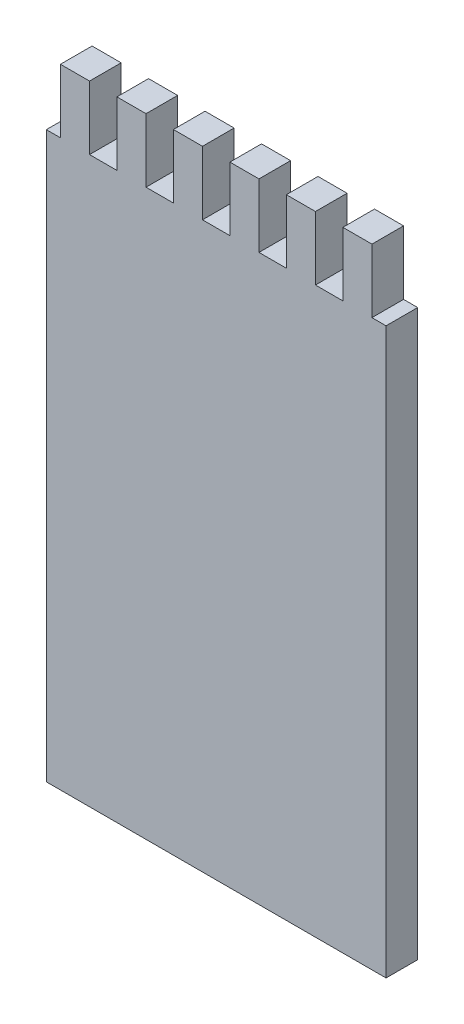
ISO-10303-21;
HEADER;
FILE_DESCRIPTION(('STEP AP214'),'2;1');
FILE_NAME('part.step','',(''),(''),'','','');
FILE_SCHEMA(('AUTOMOTIVE_DESIGN { 1 0 10303 214 1 1 1 1 }'));
ENDSEC;
DATA;
#1=APPLICATION_CONTEXT('core data for automotive mechanical design processes');
#2=APPLICATION_PROTOCOL_DEFINITION('international standard','automotive_design',2000,#1);
#3=PRODUCT_CONTEXT('',#1,'mechanical');
#4=PRODUCT('Part','Part','',(#3));
#5=PRODUCT_RELATED_PRODUCT_CATEGORY('part','',(#4));
#6=PRODUCT_DEFINITION_FORMATION('','',#4);
#7=PRODUCT_DEFINITION_CONTEXT('part definition',#1,'design');
#8=PRODUCT_DEFINITION('design','',#6,#7);
#9=PRODUCT_DEFINITION_SHAPE('','',#8);
#10=(LENGTH_UNIT() NAMED_UNIT(*) SI_UNIT(.MILLI.,.METRE.));
#11=(NAMED_UNIT(*) PLANE_ANGLE_UNIT() SI_UNIT($,.RADIAN.));
#12=(NAMED_UNIT(*) SI_UNIT($,.STERADIAN.) SOLID_ANGLE_UNIT());
#13=UNCERTAINTY_MEASURE_WITH_UNIT(LENGTH_MEASURE(1.E-05),#10,'distance_accuracy_value','');
#14=(GEOMETRIC_REPRESENTATION_CONTEXT(3) GLOBAL_UNCERTAINTY_ASSIGNED_CONTEXT((#13)) GLOBAL_UNIT_ASSIGNED_CONTEXT((#10,
#11,#12)) REPRESENTATION_CONTEXT('',''));
#15=CARTESIAN_POINT('',(0.,0.,0.));
#16=DIRECTION('',(0.,0.,1.));
#17=DIRECTION('',(1.,0.,0.));
#18=AXIS2_PLACEMENT_3D('',#15,#16,#17);
#19=CARTESIAN_POINT('',(27.575,44.6,5.6));
#20=DIRECTION('',(0.,-1.,0.));
#21=DIRECTION('',(1.,0.,0.));
#22=AXIS2_PLACEMENT_3D('',#19,#20,#21);
#23=PLANE('',#22);
#24=DIRECTION('',(-1.,0.,0.));
#25=VECTOR('',#24,1.);
#26=CARTESIAN_POINT('',(27.575,44.6,0.));
#27=LINE('',#26,#25);
#28=CARTESIAN_POINT('',(30.075,44.6,0.));
#29=VERTEX_POINT('',#28);
#30=CARTESIAN_POINT('',(27.575,44.6,0.));
#31=VERTEX_POINT('',#30);
#32=EDGE_CURVE('E249',#29,#31,#27,.T.);
#33=ORIENTED_EDGE('',*,*,#32,.T.);
#34=DIRECTION('',(0.,0.,-1.));
#35=VECTOR('',#34,1.);
#36=CARTESIAN_POINT('',(27.575,44.6,5.6));
#37=LINE('',#36,#35);
#38=CARTESIAN_POINT('',(27.575,44.6,5.6));
#39=VERTEX_POINT('',#38);
#40=EDGE_CURVE('E11',#39,#31,#37,.T.);
#41=ORIENTED_EDGE('',*,*,#40,.F.);
#42=DIRECTION('',(-1.,0.,0.));
#43=VECTOR('',#42,1.);
#44=CARTESIAN_POINT('',(27.575,44.6,5.6));
#45=LINE('',#44,#43);
#46=CARTESIAN_POINT('',(30.075,44.6,5.6));
#47=VERTEX_POINT('',#46);
#48=EDGE_CURVE('E303',#47,#39,#45,.T.);
#49=ORIENTED_EDGE('',*,*,#48,.F.);
#50=DIRECTION('',(0.,0.,-1.));
#51=VECTOR('',#50,1.);
#52=CARTESIAN_POINT('',(30.075,44.6,5.6));
#53=LINE('',#52,#51);
#54=EDGE_CURVE('E245',#47,#29,#53,.T.);
#55=ORIENTED_EDGE('',*,*,#54,.T.);
#56=EDGE_LOOP('',(#33,#41,#49,#55));
#57=FACE_BOUND('',#56,.T.);
#58=ADVANCED_FACE('F33',(#57),#23,.F.);
#59=CARTESIAN_POINT('',(27.575,44.6,5.6));
#60=DIRECTION('',(-1.,0.,0.));
#61=DIRECTION('',(0.,-1.,0.));
#62=AXIS2_PLACEMENT_3D('',#59,#60,#61);
#63=PLANE('',#62);
#64=DIRECTION('',(0.,1.,0.));
#65=VECTOR('',#64,1.);
#66=CARTESIAN_POINT('',(27.575,44.6,0.));
#67=LINE('',#66,#65);
#68=CARTESIAN_POINT('',(27.575,55.875,0.));
#69=VERTEX_POINT('',#68);
#70=EDGE_CURVE('E252',#31,#69,#67,.T.);
#71=ORIENTED_EDGE('',*,*,#70,.T.);
#72=DIRECTION('',(0.,0.,-1.));
#73=VECTOR('',#72,1.);
#74=CARTESIAN_POINT('',(27.575,55.875,5.6));
#75=LINE('',#74,#73);
#76=CARTESIAN_POINT('',(27.575,55.875,5.6));
#77=VERTEX_POINT('',#76);
#78=EDGE_CURVE('E41',#77,#69,#75,.T.);
#79=ORIENTED_EDGE('',*,*,#78,.F.);
#80=DIRECTION('',(0.,1.,0.));
#81=VECTOR('',#80,1.);
#82=CARTESIAN_POINT('',(27.575,44.6,5.6));
#83=LINE('',#82,#81);
#84=EDGE_CURVE('E151',#39,#77,#83,.T.);
#85=ORIENTED_EDGE('',*,*,#84,.F.);
#86=ORIENTED_EDGE('',*,*,#40,.T.);
#87=EDGE_LOOP('',(#71,#79,#85,#86));
#88=FACE_BOUND('',#87,.T.);
#89=ADVANCED_FACE('F461',(#88),#63,.F.);
#90=CARTESIAN_POINT('',(22.425,55.875,5.6));
#91=DIRECTION('',(0.,-1.,0.));
#92=DIRECTION('',(0.,0.,-1.));
#93=AXIS2_PLACEMENT_3D('',#90,#91,#92);
#94=PLANE('',#93);
#95=DIRECTION('',(-1.,0.,0.));
#96=VECTOR('',#95,1.);
#97=CARTESIAN_POINT('',(22.425,55.875,0.));
#98=LINE('',#97,#96);
#99=CARTESIAN_POINT('',(22.425,55.875,0.));
#100=VERTEX_POINT('',#99);
#101=EDGE_CURVE('E254',#69,#100,#98,.T.);
#102=ORIENTED_EDGE('',*,*,#101,.T.);
#103=DIRECTION('',(0.,0.,-1.));
#104=VECTOR('',#103,1.);
#105=CARTESIAN_POINT('',(22.425,55.875,5.6));
#106=LINE('',#105,#104);
#107=CARTESIAN_POINT('',(22.425,55.875,5.6));
#108=VERTEX_POINT('',#107);
#109=EDGE_CURVE('E370',#108,#100,#106,.T.);
#110=ORIENTED_EDGE('',*,*,#109,.F.);
#111=DIRECTION('',(-1.,0.,0.));
#112=VECTOR('',#111,1.);
#113=CARTESIAN_POINT('',(22.425,55.875,5.6));
#114=LINE('',#113,#112);
#115=EDGE_CURVE('E378',#77,#108,#114,.T.);
#116=ORIENTED_EDGE('',*,*,#115,.F.);
#117=ORIENTED_EDGE('',*,*,#78,.T.);
#118=EDGE_LOOP('',(#102,#110,#116,#117));
#119=FACE_BOUND('',#118,.T.);
#120=ADVANCED_FACE('F376',(#119),#94,.F.);
#121=CARTESIAN_POINT('',(22.425,44.6,5.6));
#122=DIRECTION('',(1.,0.,0.));
#123=DIRECTION('',(0.,0.,-1.));
#124=AXIS2_PLACEMENT_3D('',#121,#122,#123);
#125=PLANE('',#124);
#126=DIRECTION('',(0.,-1.,0.));
#127=VECTOR('',#126,1.);
#128=CARTESIAN_POINT('',(22.425,44.6,0.));
#129=LINE('',#128,#127);
#130=CARTESIAN_POINT('',(22.425,44.6,0.));
#131=VERTEX_POINT('',#130);
#132=EDGE_CURVE('E256',#100,#131,#129,.T.);
#133=ORIENTED_EDGE('',*,*,#132,.T.);
#134=DIRECTION('',(0.,0.,-1.));
#135=VECTOR('',#134,1.);
#136=CARTESIAN_POINT('',(22.425,44.6,5.6));
#137=LINE('',#136,#135);
#138=CARTESIAN_POINT('',(22.425,44.6,5.6));
#139=VERTEX_POINT('',#138);
#140=EDGE_CURVE('E367',#139,#131,#137,.T.);
#141=ORIENTED_EDGE('',*,*,#140,.F.);
#142=DIRECTION('',(0.,-1.,0.));
#143=VECTOR('',#142,1.);
#144=CARTESIAN_POINT('',(22.425,44.6,5.6));
#145=LINE('',#144,#143);
#146=EDGE_CURVE('E396',#108,#139,#145,.T.);
#147=ORIENTED_EDGE('',*,*,#146,.F.);
#148=ORIENTED_EDGE('',*,*,#109,.T.);
#149=EDGE_LOOP('',(#133,#141,#147,#148));
#150=FACE_BOUND('',#149,.T.);
#151=ADVANCED_FACE('F387',(#150),#125,.F.);
#152=CARTESIAN_POINT('',(17.575,44.6,5.6));
#153=DIRECTION('',(0.,-1.,0.));
#154=DIRECTION('',(0.,0.,-1.));
#155=AXIS2_PLACEMENT_3D('',#152,#153,#154);
#156=PLANE('',#155);
#157=DIRECTION('',(-1.,0.,0.));
#158=VECTOR('',#157,1.);
#159=CARTESIAN_POINT('',(17.575,44.6,0.));
#160=LINE('',#159,#158);
#161=CARTESIAN_POINT('',(17.575,44.6,0.));
#162=VERTEX_POINT('',#161);
#163=EDGE_CURVE('E258',#131,#162,#160,.T.);
#164=ORIENTED_EDGE('',*,*,#163,.T.);
#165=DIRECTION('',(0.,0.,-1.));
#166=VECTOR('',#165,1.);
#167=CARTESIAN_POINT('',(17.575,44.6,5.6));
#168=LINE('',#167,#166);
#169=CARTESIAN_POINT('',(17.575,44.6,5.6));
#170=VERTEX_POINT('',#169);
#171=EDGE_CURVE('E364',#170,#162,#168,.T.);
#172=ORIENTED_EDGE('',*,*,#171,.F.);
#173=DIRECTION('',(-1.,0.,0.));
#174=VECTOR('',#173,1.);
#175=CARTESIAN_POINT('',(17.575,44.6,5.6));
#176=LINE('',#175,#174);
#177=EDGE_CURVE('E393',#139,#170,#176,.T.);
#178=ORIENTED_EDGE('',*,*,#177,.F.);
#179=ORIENTED_EDGE('',*,*,#140,.T.);
#180=EDGE_LOOP('',(#164,#172,#178,#179));
#181=FACE_BOUND('',#180,.T.);
#182=ADVANCED_FACE('F391',(#181),#156,.F.);
#183=CARTESIAN_POINT('',(17.575,44.6,5.6));
#184=DIRECTION('',(-1.,0.,0.));
#185=DIRECTION('',(0.,0.,1.));
#186=AXIS2_PLACEMENT_3D('',#183,#184,#185);
#187=PLANE('',#186);
#188=DIRECTION('',(0.,1.,0.));
#189=VECTOR('',#188,1.);
#190=CARTESIAN_POINT('',(17.575,44.6,0.));
#191=LINE('',#190,#189);
#192=CARTESIAN_POINT('',(17.575,55.875,0.));
#193=VERTEX_POINT('',#192);
#194=EDGE_CURVE('E260',#162,#193,#191,.T.);
#195=ORIENTED_EDGE('',*,*,#194,.T.);
#196=DIRECTION('',(0.,0.,-1.));
#197=VECTOR('',#196,1.);
#198=CARTESIAN_POINT('',(17.575,55.875,5.6));
#199=LINE('',#198,#197);
#200=CARTESIAN_POINT('',(17.575,55.875,5.6));
#201=VERTEX_POINT('',#200);
#202=EDGE_CURVE('E361',#201,#193,#199,.T.);
#203=ORIENTED_EDGE('',*,*,#202,.F.);
#204=DIRECTION('',(0.,1.,0.));
#205=VECTOR('',#204,1.);
#206=CARTESIAN_POINT('',(17.575,44.6,5.6));
#207=LINE('',#206,#205);
#208=EDGE_CURVE('E395',#170,#201,#207,.T.);
#209=ORIENTED_EDGE('',*,*,#208,.F.);
#210=ORIENTED_EDGE('',*,*,#171,.T.);
#211=EDGE_LOOP('',(#195,#203,#209,#210));
#212=FACE_BOUND('',#211,.T.);
#213=ADVANCED_FACE('F474',(#212),#187,.F.);
#214=CARTESIAN_POINT('',(12.425,55.875,5.6));
#215=DIRECTION('',(0.,-1.,0.));
#216=DIRECTION('',(0.,0.,-1.));
#217=AXIS2_PLACEMENT_3D('',#214,#215,#216);
#218=PLANE('',#217);
#219=DIRECTION('',(-1.,0.,0.));
#220=VECTOR('',#219,1.);
#221=CARTESIAN_POINT('',(12.425,55.875,0.));
#222=LINE('',#221,#220);
#223=CARTESIAN_POINT('',(12.425,55.875,0.));
#224=VERTEX_POINT('',#223);
#225=EDGE_CURVE('E262',#193,#224,#222,.T.);
#226=ORIENTED_EDGE('',*,*,#225,.T.);
#227=DIRECTION('',(0.,0.,-1.));
#228=VECTOR('',#227,1.);
#229=CARTESIAN_POINT('',(12.425,55.875,5.6));
#230=LINE('',#229,#228);
#231=CARTESIAN_POINT('',(12.425,55.875,5.6));
#232=VERTEX_POINT('',#231);
#233=EDGE_CURVE('E358',#232,#224,#230,.T.);
#234=ORIENTED_EDGE('',*,*,#233,.F.);
#235=DIRECTION('',(-1.,0.,0.));
#236=VECTOR('',#235,1.);
#237=CARTESIAN_POINT('',(12.425,55.875,5.6));
#238=LINE('',#237,#236);
#239=EDGE_CURVE('E398',#201,#232,#238,.T.);
#240=ORIENTED_EDGE('',*,*,#239,.F.);
#241=ORIENTED_EDGE('',*,*,#202,.T.);
#242=EDGE_LOOP('',(#226,#234,#240,#241));
#243=FACE_BOUND('',#242,.T.);
#244=ADVANCED_FACE('F477',(#243),#218,.F.);
#245=CARTESIAN_POINT('',(12.425,44.6,5.6));
#246=DIRECTION('',(1.,0.,0.));
#247=DIRECTION('',(0.,0.,-1.));
#248=AXIS2_PLACEMENT_3D('',#245,#246,#247);
#249=PLANE('',#248);
#250=DIRECTION('',(0.,-1.,0.));
#251=VECTOR('',#250,1.);
#252=CARTESIAN_POINT('',(12.425,44.6,0.));
#253=LINE('',#252,#251);
#254=CARTESIAN_POINT('',(12.425,44.6,0.));
#255=VERTEX_POINT('',#254);
#256=EDGE_CURVE('E264',#224,#255,#253,.T.);
#257=ORIENTED_EDGE('',*,*,#256,.T.);
#258=DIRECTION('',(0.,0.,-1.));
#259=VECTOR('',#258,1.);
#260=CARTESIAN_POINT('',(12.425,44.6,5.6));
#261=LINE('',#260,#259);
#262=CARTESIAN_POINT('',(12.425,44.6,5.6));
#263=VERTEX_POINT('',#262);
#264=EDGE_CURVE('E355',#263,#255,#261,.T.);
#265=ORIENTED_EDGE('',*,*,#264,.F.);
#266=DIRECTION('',(0.,-1.,0.));
#267=VECTOR('',#266,1.);
#268=CARTESIAN_POINT('',(12.425,44.6,5.6));
#269=LINE('',#268,#267);
#270=EDGE_CURVE('E404',#232,#263,#269,.T.);
#271=ORIENTED_EDGE('',*,*,#270,.F.);
#272=ORIENTED_EDGE('',*,*,#233,.T.);
#273=EDGE_LOOP('',(#257,#265,#271,#272));
#274=FACE_BOUND('',#273,.T.);
#275=ADVANCED_FACE('F481',(#274),#249,.F.);
#276=CARTESIAN_POINT('',(7.575,44.6,5.6));
#277=DIRECTION('',(0.,-1.,0.));
#278=DIRECTION('',(0.,0.,-1.));
#279=AXIS2_PLACEMENT_3D('',#276,#277,#278);
#280=PLANE('',#279);
#281=DIRECTION('',(-1.,0.,0.));
#282=VECTOR('',#281,1.);
#283=CARTESIAN_POINT('',(7.575,44.6,0.));
#284=LINE('',#283,#282);
#285=CARTESIAN_POINT('',(7.575,44.6,0.));
#286=VERTEX_POINT('',#285);
#287=EDGE_CURVE('E266',#255,#286,#284,.T.);
#288=ORIENTED_EDGE('',*,*,#287,.T.);
#289=DIRECTION('',(0.,0.,-1.));
#290=VECTOR('',#289,1.);
#291=CARTESIAN_POINT('',(7.575,44.6,5.6));
#292=LINE('',#291,#290);
#293=CARTESIAN_POINT('',(7.575,44.6,5.6));
#294=VERTEX_POINT('',#293);
#295=EDGE_CURVE('E352',#294,#286,#292,.T.);
#296=ORIENTED_EDGE('',*,*,#295,.F.);
#297=DIRECTION('',(-1.,0.,0.));
#298=VECTOR('',#297,1.);
#299=CARTESIAN_POINT('',(7.575,44.6,5.6));
#300=LINE('',#299,#298);
#301=EDGE_CURVE('E406',#263,#294,#300,.T.);
#302=ORIENTED_EDGE('',*,*,#301,.F.);
#303=ORIENTED_EDGE('',*,*,#264,.T.);
#304=EDGE_LOOP('',(#288,#296,#302,#303));
#305=FACE_BOUND('',#304,.T.);
#306=ADVANCED_FACE('F485',(#305),#280,.F.);
#307=CARTESIAN_POINT('',(7.575,44.6,5.6));
#308=DIRECTION('',(-1.,0.,0.));
#309=DIRECTION('',(0.,0.,1.));
#310=AXIS2_PLACEMENT_3D('',#307,#308,#309);
#311=PLANE('',#310);
#312=DIRECTION('',(0.,1.,0.));
#313=VECTOR('',#312,1.);
#314=CARTESIAN_POINT('',(7.575,44.6,0.));
#315=LINE('',#314,#313);
#316=CARTESIAN_POINT('',(7.575,55.875,0.));
#317=VERTEX_POINT('',#316);
#318=EDGE_CURVE('E268',#286,#317,#315,.T.);
#319=ORIENTED_EDGE('',*,*,#318,.T.);
#320=DIRECTION('',(0.,0.,-1.));
#321=VECTOR('',#320,1.);
#322=CARTESIAN_POINT('',(7.575,55.875,5.6));
#323=LINE('',#322,#321);
#324=CARTESIAN_POINT('',(7.575,55.875,5.6));
#325=VERTEX_POINT('',#324);
#326=EDGE_CURVE('E349',#325,#317,#323,.T.);
#327=ORIENTED_EDGE('',*,*,#326,.F.);
#328=DIRECTION('',(0.,1.,0.));
#329=VECTOR('',#328,1.);
#330=CARTESIAN_POINT('',(7.575,44.6,5.6));
#331=LINE('',#330,#329);
#332=EDGE_CURVE('E408',#294,#325,#331,.T.);
#333=ORIENTED_EDGE('',*,*,#332,.F.);
#334=ORIENTED_EDGE('',*,*,#295,.T.);
#335=EDGE_LOOP('',(#319,#327,#333,#334));
#336=FACE_BOUND('',#335,.T.);
#337=ADVANCED_FACE('F489',(#336),#311,.F.);
#338=CARTESIAN_POINT('',(2.425,55.875,5.6));
#339=DIRECTION('',(0.,-1.,0.));
#340=DIRECTION('',(0.,0.,-1.));
#341=AXIS2_PLACEMENT_3D('',#338,#339,#340);
#342=PLANE('',#341);
#343=DIRECTION('',(-1.,0.,0.));
#344=VECTOR('',#343,1.);
#345=CARTESIAN_POINT('',(2.425,55.875,0.));
#346=LINE('',#345,#344);
#347=CARTESIAN_POINT('',(2.425,55.875,0.));
#348=VERTEX_POINT('',#347);
#349=EDGE_CURVE('E270',#317,#348,#346,.T.);
#350=ORIENTED_EDGE('',*,*,#349,.T.);
#351=DIRECTION('',(0.,0.,-1.));
#352=VECTOR('',#351,1.);
#353=CARTESIAN_POINT('',(2.425,55.875,5.6));
#354=LINE('',#353,#352);
#355=CARTESIAN_POINT('',(2.425,55.875,5.6));
#356=VERTEX_POINT('',#355);
#357=EDGE_CURVE('E346',#356,#348,#354,.T.);
#358=ORIENTED_EDGE('',*,*,#357,.F.);
#359=DIRECTION('',(-1.,0.,0.));
#360=VECTOR('',#359,1.);
#361=CARTESIAN_POINT('',(2.425,55.875,5.6));
#362=LINE('',#361,#360);
#363=EDGE_CURVE('E410',#325,#356,#362,.T.);
#364=ORIENTED_EDGE('',*,*,#363,.F.);
#365=ORIENTED_EDGE('',*,*,#326,.T.);
#366=EDGE_LOOP('',(#350,#358,#364,#365));
#367=FACE_BOUND('',#366,.T.);
#368=ADVANCED_FACE('F493',(#367),#342,.F.);
#369=CARTESIAN_POINT('',(2.425,44.6,5.6));
#370=DIRECTION('',(1.,0.,0.));
#371=DIRECTION('',(0.,0.,-1.));
#372=AXIS2_PLACEMENT_3D('',#369,#370,#371);
#373=PLANE('',#372);
#374=DIRECTION('',(0.,-1.,0.));
#375=VECTOR('',#374,1.);
#376=CARTESIAN_POINT('',(2.425,44.6,0.));
#377=LINE('',#376,#375);
#378=CARTESIAN_POINT('',(2.425,44.6,0.));
#379=VERTEX_POINT('',#378);
#380=EDGE_CURVE('E272',#348,#379,#377,.T.);
#381=ORIENTED_EDGE('',*,*,#380,.T.);
#382=DIRECTION('',(0.,0.,-1.));
#383=VECTOR('',#382,1.);
#384=CARTESIAN_POINT('',(2.425,44.6,5.6));
#385=LINE('',#384,#383);
#386=CARTESIAN_POINT('',(2.425,44.6,5.6));
#387=VERTEX_POINT('',#386);
#388=EDGE_CURVE('E343',#387,#379,#385,.T.);
#389=ORIENTED_EDGE('',*,*,#388,.F.);
#390=DIRECTION('',(0.,-1.,0.));
#391=VECTOR('',#390,1.);
#392=CARTESIAN_POINT('',(2.425,44.6,5.6));
#393=LINE('',#392,#391);
#394=EDGE_CURVE('E412',#356,#387,#393,.T.);
#395=ORIENTED_EDGE('',*,*,#394,.F.);
#396=ORIENTED_EDGE('',*,*,#357,.T.);
#397=EDGE_LOOP('',(#381,#389,#395,#396));
#398=FACE_BOUND('',#397,.T.);
#399=ADVANCED_FACE('F497',(#398),#373,.F.);
#400=CARTESIAN_POINT('',(-2.425,44.6,5.6));
#401=DIRECTION('',(0.,-1.,0.));
#402=DIRECTION('',(0.,0.,-1.));
#403=AXIS2_PLACEMENT_3D('',#400,#401,#402);
#404=PLANE('',#403);
#405=DIRECTION('',(-1.,0.,0.));
#406=VECTOR('',#405,1.);
#407=CARTESIAN_POINT('',(-2.425,44.6,0.));
#408=LINE('',#407,#406);
#409=CARTESIAN_POINT('',(-2.425,44.6,0.));
#410=VERTEX_POINT('',#409);
#411=EDGE_CURVE('E274',#379,#410,#408,.T.);
#412=ORIENTED_EDGE('',*,*,#411,.T.);
#413=DIRECTION('',(0.,0.,-1.));
#414=VECTOR('',#413,1.);
#415=CARTESIAN_POINT('',(-2.425,44.6,5.6));
#416=LINE('',#415,#414);
#417=CARTESIAN_POINT('',(-2.425,44.6,5.6));
#418=VERTEX_POINT('',#417);
#419=EDGE_CURVE('E340',#418,#410,#416,.T.);
#420=ORIENTED_EDGE('',*,*,#419,.F.);
#421=DIRECTION('',(-1.,0.,0.));
#422=VECTOR('',#421,1.);
#423=CARTESIAN_POINT('',(-2.425,44.6,5.6));
#424=LINE('',#423,#422);
#425=EDGE_CURVE('E414',#387,#418,#424,.T.);
#426=ORIENTED_EDGE('',*,*,#425,.F.);
#427=ORIENTED_EDGE('',*,*,#388,.T.);
#428=EDGE_LOOP('',(#412,#420,#426,#427));
#429=FACE_BOUND('',#428,.T.);
#430=ADVANCED_FACE('F501',(#429),#404,.F.);
#431=CARTESIAN_POINT('',(-2.425,44.6,5.6));
#432=DIRECTION('',(-1.,0.,0.));
#433=DIRECTION('',(0.,0.,1.));
#434=AXIS2_PLACEMENT_3D('',#431,#432,#433);
#435=PLANE('',#434);
#436=DIRECTION('',(0.,1.,0.));
#437=VECTOR('',#436,1.);
#438=CARTESIAN_POINT('',(-2.425,44.6,0.));
#439=LINE('',#438,#437);
#440=CARTESIAN_POINT('',(-2.425,55.875,0.));
#441=VERTEX_POINT('',#440);
#442=EDGE_CURVE('E276',#410,#441,#439,.T.);
#443=ORIENTED_EDGE('',*,*,#442,.T.);
#444=DIRECTION('',(0.,0.,-1.));
#445=VECTOR('',#444,1.);
#446=CARTESIAN_POINT('',(-2.425,55.875,5.6));
#447=LINE('',#446,#445);
#448=CARTESIAN_POINT('',(-2.425,55.875,5.6));
#449=VERTEX_POINT('',#448);
#450=EDGE_CURVE('E337',#449,#441,#447,.T.);
#451=ORIENTED_EDGE('',*,*,#450,.F.);
#452=DIRECTION('',(0.,1.,0.));
#453=VECTOR('',#452,1.);
#454=CARTESIAN_POINT('',(-2.425,44.6,5.6));
#455=LINE('',#454,#453);
#456=EDGE_CURVE('E416',#418,#449,#455,.T.);
#457=ORIENTED_EDGE('',*,*,#456,.F.);
#458=ORIENTED_EDGE('',*,*,#419,.T.);
#459=EDGE_LOOP('',(#443,#451,#457,#458));
#460=FACE_BOUND('',#459,.T.);
#461=ADVANCED_FACE('F505',(#460),#435,.F.);
#462=CARTESIAN_POINT('',(-7.575,55.875,5.6));
#463=DIRECTION('',(0.,-1.,0.));
#464=DIRECTION('',(0.,0.,-1.));
#465=AXIS2_PLACEMENT_3D('',#462,#463,#464);
#466=PLANE('',#465);
#467=DIRECTION('',(-1.,0.,0.));
#468=VECTOR('',#467,1.);
#469=CARTESIAN_POINT('',(-7.575,55.875,0.));
#470=LINE('',#469,#468);
#471=CARTESIAN_POINT('',(-7.575,55.875,0.));
#472=VERTEX_POINT('',#471);
#473=EDGE_CURVE('E278',#441,#472,#470,.T.);
#474=ORIENTED_EDGE('',*,*,#473,.T.);
#475=DIRECTION('',(0.,0.,-1.));
#476=VECTOR('',#475,1.);
#477=CARTESIAN_POINT('',(-7.575,55.875,5.6));
#478=LINE('',#477,#476);
#479=CARTESIAN_POINT('',(-7.575,55.875,5.6));
#480=VERTEX_POINT('',#479);
#481=EDGE_CURVE('E334',#480,#472,#478,.T.);
#482=ORIENTED_EDGE('',*,*,#481,.F.);
#483=DIRECTION('',(-1.,0.,0.));
#484=VECTOR('',#483,1.);
#485=CARTESIAN_POINT('',(-7.575,55.875,5.6));
#486=LINE('',#485,#484);
#487=EDGE_CURVE('E418',#449,#480,#486,.T.);
#488=ORIENTED_EDGE('',*,*,#487,.F.);
#489=ORIENTED_EDGE('',*,*,#450,.T.);
#490=EDGE_LOOP('',(#474,#482,#488,#489));
#491=FACE_BOUND('',#490,.T.);
#492=ADVANCED_FACE('F509',(#491),#466,.F.);
#493=CARTESIAN_POINT('',(-7.575,44.6,5.6));
#494=DIRECTION('',(1.,0.,0.));
#495=DIRECTION('',(0.,1.,0.));
#496=AXIS2_PLACEMENT_3D('',#493,#494,#495);
#497=PLANE('',#496);
#498=DIRECTION('',(0.,-1.,0.));
#499=VECTOR('',#498,1.);
#500=CARTESIAN_POINT('',(-7.575,44.6,0.));
#501=LINE('',#500,#499);
#502=CARTESIAN_POINT('',(-7.575,44.6,0.));
#503=VERTEX_POINT('',#502);
#504=EDGE_CURVE('E280',#472,#503,#501,.T.);
#505=ORIENTED_EDGE('',*,*,#504,.T.);
#506=DIRECTION('',(0.,0.,-1.));
#507=VECTOR('',#506,1.);
#508=CARTESIAN_POINT('',(-7.575,44.6,5.6));
#509=LINE('',#508,#507);
#510=CARTESIAN_POINT('',(-7.575,44.6,5.6));
#511=VERTEX_POINT('',#510);
#512=EDGE_CURVE('E331',#511,#503,#509,.T.);
#513=ORIENTED_EDGE('',*,*,#512,.F.);
#514=DIRECTION('',(0.,-1.,0.));
#515=VECTOR('',#514,1.);
#516=CARTESIAN_POINT('',(-7.575,44.6,5.6));
#517=LINE('',#516,#515);
#518=EDGE_CURVE('E420',#480,#511,#517,.T.);
#519=ORIENTED_EDGE('',*,*,#518,.F.);
#520=ORIENTED_EDGE('',*,*,#481,.T.);
#521=EDGE_LOOP('',(#505,#513,#519,#520));
#522=FACE_BOUND('',#521,.T.);
#523=ADVANCED_FACE('F513',(#522),#497,.F.);
#524=CARTESIAN_POINT('',(-12.425,44.6,5.6));
#525=DIRECTION('',(0.,-1.,0.));
#526=DIRECTION('',(0.,0.,-1.));
#527=AXIS2_PLACEMENT_3D('',#524,#525,#526);
#528=PLANE('',#527);
#529=DIRECTION('',(-1.,0.,0.));
#530=VECTOR('',#529,1.);
#531=CARTESIAN_POINT('',(-12.425,44.6,0.));
#532=LINE('',#531,#530);
#533=CARTESIAN_POINT('',(-12.425,44.6,0.));
#534=VERTEX_POINT('',#533);
#535=EDGE_CURVE('E282',#503,#534,#532,.T.);
#536=ORIENTED_EDGE('',*,*,#535,.T.);
#537=DIRECTION('',(0.,0.,-1.));
#538=VECTOR('',#537,1.);
#539=CARTESIAN_POINT('',(-12.425,44.6,5.6));
#540=LINE('',#539,#538);
#541=CARTESIAN_POINT('',(-12.425,44.6,5.6));
#542=VERTEX_POINT('',#541);
#543=EDGE_CURVE('E328',#542,#534,#540,.T.);
#544=ORIENTED_EDGE('',*,*,#543,.F.);
#545=DIRECTION('',(-1.,0.,0.));
#546=VECTOR('',#545,1.);
#547=CARTESIAN_POINT('',(-12.425,44.6,5.6));
#548=LINE('',#547,#546);
#549=EDGE_CURVE('E422',#511,#542,#548,.T.);
#550=ORIENTED_EDGE('',*,*,#549,.F.);
#551=ORIENTED_EDGE('',*,*,#512,.T.);
#552=EDGE_LOOP('',(#536,#544,#550,#551));
#553=FACE_BOUND('',#552,.T.);
#554=ADVANCED_FACE('F517',(#553),#528,.F.);
#555=CARTESIAN_POINT('',(-12.425,44.6,5.6));
#556=DIRECTION('',(-1.,0.,0.));
#557=DIRECTION('',(0.,0.,1.));
#558=AXIS2_PLACEMENT_3D('',#555,#556,#557);
#559=PLANE('',#558);
#560=DIRECTION('',(0.,1.,0.));
#561=VECTOR('',#560,1.);
#562=CARTESIAN_POINT('',(-12.425,44.6,0.));
#563=LINE('',#562,#561);
#564=CARTESIAN_POINT('',(-12.425,55.875,0.));
#565=VERTEX_POINT('',#564);
#566=EDGE_CURVE('E284',#534,#565,#563,.T.);
#567=ORIENTED_EDGE('',*,*,#566,.T.);
#568=DIRECTION('',(0.,0.,-1.));
#569=VECTOR('',#568,1.);
#570=CARTESIAN_POINT('',(-12.425,55.875,5.6));
#571=LINE('',#570,#569);
#572=CARTESIAN_POINT('',(-12.425,55.875,5.6));
#573=VERTEX_POINT('',#572);
#574=EDGE_CURVE('E325',#573,#565,#571,.T.);
#575=ORIENTED_EDGE('',*,*,#574,.F.);
#576=DIRECTION('',(0.,1.,0.));
#577=VECTOR('',#576,1.);
#578=CARTESIAN_POINT('',(-12.425,44.6,5.6));
#579=LINE('',#578,#577);
#580=EDGE_CURVE('E424',#542,#573,#579,.T.);
#581=ORIENTED_EDGE('',*,*,#580,.F.);
#582=ORIENTED_EDGE('',*,*,#543,.T.);
#583=EDGE_LOOP('',(#567,#575,#581,#582));
#584=FACE_BOUND('',#583,.T.);
#585=ADVANCED_FACE('F521',(#584),#559,.F.);
#586=CARTESIAN_POINT('',(-17.575,55.875,5.6));
#587=DIRECTION('',(0.,-1.,0.));
#588=DIRECTION('',(0.,0.,-1.));
#589=AXIS2_PLACEMENT_3D('',#586,#587,#588);
#590=PLANE('',#589);
#591=DIRECTION('',(-1.,0.,0.));
#592=VECTOR('',#591,1.);
#593=CARTESIAN_POINT('',(-17.575,55.875,0.));
#594=LINE('',#593,#592);
#595=CARTESIAN_POINT('',(-17.575,55.875,0.));
#596=VERTEX_POINT('',#595);
#597=EDGE_CURVE('E286',#565,#596,#594,.T.);
#598=ORIENTED_EDGE('',*,*,#597,.T.);
#599=DIRECTION('',(0.,0.,-1.));
#600=VECTOR('',#599,1.);
#601=CARTESIAN_POINT('',(-17.575,55.875,5.6));
#602=LINE('',#601,#600);
#603=CARTESIAN_POINT('',(-17.575,55.875,5.6));
#604=VERTEX_POINT('',#603);
#605=EDGE_CURVE('E322',#604,#596,#602,.T.);
#606=ORIENTED_EDGE('',*,*,#605,.F.);
#607=DIRECTION('',(-1.,0.,0.));
#608=VECTOR('',#607,1.);
#609=CARTESIAN_POINT('',(-17.575,55.875,5.6));
#610=LINE('',#609,#608);
#611=EDGE_CURVE('E426',#573,#604,#610,.T.);
#612=ORIENTED_EDGE('',*,*,#611,.F.);
#613=ORIENTED_EDGE('',*,*,#574,.T.);
#614=EDGE_LOOP('',(#598,#606,#612,#613));
#615=FACE_BOUND('',#614,.T.);
#616=ADVANCED_FACE('F525',(#615),#590,.F.);
#617=CARTESIAN_POINT('',(-17.575,44.6,5.6));
#618=DIRECTION('',(1.,0.,0.));
#619=DIRECTION('',(0.,0.,-1.));
#620=AXIS2_PLACEMENT_3D('',#617,#618,#619);
#621=PLANE('',#620);
#622=DIRECTION('',(0.,-1.,0.));
#623=VECTOR('',#622,1.);
#624=CARTESIAN_POINT('',(-17.575,44.6,0.));
#625=LINE('',#624,#623);
#626=CARTESIAN_POINT('',(-17.575,44.6,0.));
#627=VERTEX_POINT('',#626);
#628=EDGE_CURVE('E288',#596,#627,#625,.T.);
#629=ORIENTED_EDGE('',*,*,#628,.T.);
#630=DIRECTION('',(0.,0.,-1.));
#631=VECTOR('',#630,1.);
#632=CARTESIAN_POINT('',(-17.575,44.6,5.6));
#633=LINE('',#632,#631);
#634=CARTESIAN_POINT('',(-17.575,44.6,5.6));
#635=VERTEX_POINT('',#634);
#636=EDGE_CURVE('E319',#635,#627,#633,.T.);
#637=ORIENTED_EDGE('',*,*,#636,.F.);
#638=DIRECTION('',(0.,-1.,0.));
#639=VECTOR('',#638,1.);
#640=CARTESIAN_POINT('',(-17.575,44.6,5.6));
#641=LINE('',#640,#639);
#642=EDGE_CURVE('E428',#604,#635,#641,.T.);
#643=ORIENTED_EDGE('',*,*,#642,.F.);
#644=ORIENTED_EDGE('',*,*,#605,.T.);
#645=EDGE_LOOP('',(#629,#637,#643,#644));
#646=FACE_BOUND('',#645,.T.);
#647=ADVANCED_FACE('F529',(#646),#621,.F.);
#648=CARTESIAN_POINT('',(-22.425,44.6,5.6));
#649=DIRECTION('',(0.,-1.,0.));
#650=DIRECTION('',(0.,0.,-1.));
#651=AXIS2_PLACEMENT_3D('',#648,#649,#650);
#652=PLANE('',#651);
#653=DIRECTION('',(-1.,0.,0.));
#654=VECTOR('',#653,1.);
#655=CARTESIAN_POINT('',(-22.425,44.6,0.));
#656=LINE('',#655,#654);
#657=CARTESIAN_POINT('',(-22.425,44.6,0.));
#658=VERTEX_POINT('',#657);
#659=EDGE_CURVE('E290',#627,#658,#656,.T.);
#660=ORIENTED_EDGE('',*,*,#659,.T.);
#661=DIRECTION('',(0.,0.,-1.));
#662=VECTOR('',#661,1.);
#663=CARTESIAN_POINT('',(-22.425,44.6,5.6));
#664=LINE('',#663,#662);
#665=CARTESIAN_POINT('',(-22.425,44.6,5.6));
#666=VERTEX_POINT('',#665);
#667=EDGE_CURVE('E316',#666,#658,#664,.T.);
#668=ORIENTED_EDGE('',*,*,#667,.F.);
#669=DIRECTION('',(-1.,0.,0.));
#670=VECTOR('',#669,1.);
#671=CARTESIAN_POINT('',(-22.425,44.6,5.6));
#672=LINE('',#671,#670);
#673=EDGE_CURVE('E430',#635,#666,#672,.T.);
#674=ORIENTED_EDGE('',*,*,#673,.F.);
#675=ORIENTED_EDGE('',*,*,#636,.T.);
#676=EDGE_LOOP('',(#660,#668,#674,#675));
#677=FACE_BOUND('',#676,.T.);
#678=ADVANCED_FACE('F533',(#677),#652,.F.);
#679=CARTESIAN_POINT('',(-22.425,44.6,5.6));
#680=DIRECTION('',(-1.,0.,0.));
#681=DIRECTION('',(0.,0.,1.));
#682=AXIS2_PLACEMENT_3D('',#679,#680,#681);
#683=PLANE('',#682);
#684=DIRECTION('',(0.,1.,0.));
#685=VECTOR('',#684,1.);
#686=CARTESIAN_POINT('',(-22.425,44.6,0.));
#687=LINE('',#686,#685);
#688=CARTESIAN_POINT('',(-22.425,55.875,0.));
#689=VERTEX_POINT('',#688);
#690=EDGE_CURVE('E292',#658,#689,#687,.T.);
#691=ORIENTED_EDGE('',*,*,#690,.T.);
#692=DIRECTION('',(0.,0.,-1.));
#693=VECTOR('',#692,1.);
#694=CARTESIAN_POINT('',(-22.425,55.875,5.6));
#695=LINE('',#694,#693);
#696=CARTESIAN_POINT('',(-22.425,55.875,5.6));
#697=VERTEX_POINT('',#696);
#698=EDGE_CURVE('E313',#697,#689,#695,.T.);
#699=ORIENTED_EDGE('',*,*,#698,.F.);
#700=DIRECTION('',(0.,1.,0.));
#701=VECTOR('',#700,1.);
#702=CARTESIAN_POINT('',(-22.425,44.6,5.6));
#703=LINE('',#702,#701);
#704=EDGE_CURVE('E432',#666,#697,#703,.T.);
#705=ORIENTED_EDGE('',*,*,#704,.F.);
#706=ORIENTED_EDGE('',*,*,#667,.T.);
#707=EDGE_LOOP('',(#691,#699,#705,#706));
#708=FACE_BOUND('',#707,.T.);
#709=ADVANCED_FACE('F537',(#708),#683,.F.);
#710=CARTESIAN_POINT('',(-27.575,55.875,5.6));
#711=DIRECTION('',(0.,-1.,0.));
#712=DIRECTION('',(0.,0.,-1.));
#713=AXIS2_PLACEMENT_3D('',#710,#711,#712);
#714=PLANE('',#713);
#715=DIRECTION('',(-1.,0.,0.));
#716=VECTOR('',#715,1.);
#717=CARTESIAN_POINT('',(-27.575,55.875,0.));
#718=LINE('',#717,#716);
#719=CARTESIAN_POINT('',(-27.575,55.875,0.));
#720=VERTEX_POINT('',#719);
#721=EDGE_CURVE('E294',#689,#720,#718,.T.);
#722=ORIENTED_EDGE('',*,*,#721,.T.);
#723=DIRECTION('',(0.,0.,-1.));
#724=VECTOR('',#723,1.);
#725=CARTESIAN_POINT('',(-27.575,55.875,5.6));
#726=LINE('',#725,#724);
#727=CARTESIAN_POINT('',(-27.575,55.875,5.6));
#728=VERTEX_POINT('',#727);
#729=EDGE_CURVE('E310',#728,#720,#726,.T.);
#730=ORIENTED_EDGE('',*,*,#729,.F.);
#731=DIRECTION('',(-1.,0.,0.));
#732=VECTOR('',#731,1.);
#733=CARTESIAN_POINT('',(-27.575,55.875,5.6));
#734=LINE('',#733,#732);
#735=EDGE_CURVE('E434',#697,#728,#734,.T.);
#736=ORIENTED_EDGE('',*,*,#735,.F.);
#737=ORIENTED_EDGE('',*,*,#698,.T.);
#738=EDGE_LOOP('',(#722,#730,#736,#737));
#739=FACE_BOUND('',#738,.T.);
#740=ADVANCED_FACE('F541',(#739),#714,.F.);
#741=CARTESIAN_POINT('',(-27.575,44.6,5.6));
#742=DIRECTION('',(1.,0.,0.));
#743=DIRECTION('',(0.,0.,-1.));
#744=AXIS2_PLACEMENT_3D('',#741,#742,#743);
#745=PLANE('',#744);
#746=DIRECTION('',(0.,-1.,0.));
#747=VECTOR('',#746,1.);
#748=CARTESIAN_POINT('',(-27.575,44.6,0.));
#749=LINE('',#748,#747);
#750=CARTESIAN_POINT('',(-27.575,44.6,0.));
#751=VERTEX_POINT('',#750);
#752=EDGE_CURVE('E296',#720,#751,#749,.T.);
#753=ORIENTED_EDGE('',*,*,#752,.T.);
#754=DIRECTION('',(0.,0.,-1.));
#755=VECTOR('',#754,1.);
#756=CARTESIAN_POINT('',(-27.575,44.6,5.6));
#757=LINE('',#756,#755);
#758=CARTESIAN_POINT('',(-27.575,44.6,5.6));
#759=VERTEX_POINT('',#758);
#760=EDGE_CURVE('E307',#759,#751,#757,.T.);
#761=ORIENTED_EDGE('',*,*,#760,.F.);
#762=DIRECTION('',(0.,-1.,0.));
#763=VECTOR('',#762,1.);
#764=CARTESIAN_POINT('',(-27.575,44.6,5.6));
#765=LINE('',#764,#763);
#766=EDGE_CURVE('E436',#728,#759,#765,.T.);
#767=ORIENTED_EDGE('',*,*,#766,.F.);
#768=ORIENTED_EDGE('',*,*,#729,.T.);
#769=EDGE_LOOP('',(#753,#761,#767,#768));
#770=FACE_BOUND('',#769,.T.);
#771=ADVANCED_FACE('F442',(#770),#745,.F.);
#772=CARTESIAN_POINT('',(-27.575,44.6,5.6));
#773=DIRECTION('',(0.,-1.,0.));
#774=DIRECTION('',(1.,0.,0.));
#775=AXIS2_PLACEMENT_3D('',#772,#773,#774);
#776=PLANE('',#775);
#777=DIRECTION('',(-1.,0.,0.));
#778=VECTOR('',#777,1.);
#779=CARTESIAN_POINT('',(-27.575,44.6,0.));
#780=LINE('',#779,#778);
#781=CARTESIAN_POINT('',(-30.075,44.6,0.));
#782=VERTEX_POINT('',#781);
#783=EDGE_CURVE('E298',#751,#782,#780,.T.);
#784=ORIENTED_EDGE('',*,*,#783,.T.);
#785=DIRECTION('',(0.,0.,-1.));
#786=VECTOR('',#785,1.);
#787=CARTESIAN_POINT('',(-30.075,44.6,5.6));
#788=LINE('',#787,#786);
#789=CARTESIAN_POINT('',(-30.075,44.6,5.6));
#790=VERTEX_POINT('',#789);
#791=EDGE_CURVE('E240',#790,#782,#788,.T.);
#792=ORIENTED_EDGE('',*,*,#791,.F.);
#793=DIRECTION('',(-1.,0.,0.));
#794=VECTOR('',#793,1.);
#795=CARTESIAN_POINT('',(-27.575,44.6,5.6));
#796=LINE('',#795,#794);
#797=EDGE_CURVE('E230',#759,#790,#796,.T.);
#798=ORIENTED_EDGE('',*,*,#797,.F.);
#799=ORIENTED_EDGE('',*,*,#760,.T.);
#800=EDGE_LOOP('',(#784,#792,#798,#799));
#801=FACE_BOUND('',#800,.T.);
#802=ADVANCED_FACE('F446',(#801),#776,.F.);
#803=CARTESIAN_POINT('',(-30.075,44.6,5.6));
#804=DIRECTION('',(1.,0.,0.));
#805=DIRECTION('',(0.,1.,0.));
#806=AXIS2_PLACEMENT_3D('',#803,#804,#805);
#807=PLANE('',#806);
#808=DIRECTION('',(0.,-1.,0.));
#809=VECTOR('',#808,1.);
#810=CARTESIAN_POINT('',(-30.075,44.6,0.));
#811=LINE('',#810,#809);
#812=CARTESIAN_POINT('',(-30.075,-55.4,0.));
#813=VERTEX_POINT('',#812);
#814=EDGE_CURVE('E239',#782,#813,#811,.T.);
#815=ORIENTED_EDGE('',*,*,#814,.T.);
#816=DIRECTION('',(0.,0.,-1.));
#817=VECTOR('',#816,1.);
#818=CARTESIAN_POINT('',(-30.075,-55.4,5.6));
#819=LINE('',#818,#817);
#820=CARTESIAN_POINT('',(-30.075,-55.4,5.6));
#821=VERTEX_POINT('',#820);
#822=EDGE_CURVE('E236',#821,#813,#819,.T.);
#823=ORIENTED_EDGE('',*,*,#822,.F.);
#824=DIRECTION('',(0.,-1.,0.));
#825=VECTOR('',#824,1.);
#826=CARTESIAN_POINT('',(-30.075,44.6,5.6));
#827=LINE('',#826,#825);
#828=EDGE_CURVE('E224',#790,#821,#827,.T.);
#829=ORIENTED_EDGE('',*,*,#828,.F.);
#830=ORIENTED_EDGE('',*,*,#791,.T.);
#831=EDGE_LOOP('',(#815,#823,#829,#830));
#832=FACE_BOUND('',#831,.T.);
#833=ADVANCED_FACE('F237',(#832),#807,.F.);
#834=CARTESIAN_POINT('',(27.575,-55.4,5.6));
#835=DIRECTION('',(0.,1.,0.));
#836=DIRECTION('',(0.,0.,1.));
#837=AXIS2_PLACEMENT_3D('',#834,#835,#836);
#838=PLANE('',#837);
#839=DIRECTION('',(1.,0.,0.));
#840=VECTOR('',#839,1.);
#841=CARTESIAN_POINT('',(27.575,-55.4,0.));
#842=LINE('',#841,#840);
#843=CARTESIAN_POINT('',(30.075,-55.4,0.));
#844=VERTEX_POINT('',#843);
#845=EDGE_CURVE('E137',#813,#844,#842,.T.);
#846=ORIENTED_EDGE('',*,*,#845,.T.);
#847=DIRECTION('',(0.,0.,-1.));
#848=VECTOR('',#847,1.);
#849=CARTESIAN_POINT('',(30.075,-55.4,5.6));
#850=LINE('',#849,#848);
#851=CARTESIAN_POINT('',(30.075,-55.4,5.6));
#852=VERTEX_POINT('',#851);
#853=EDGE_CURVE('E241',#852,#844,#850,.T.);
#854=ORIENTED_EDGE('',*,*,#853,.F.);
#855=DIRECTION('',(1.,0.,0.));
#856=VECTOR('',#855,1.);
#857=CARTESIAN_POINT('',(-27.575,-55.4,5.6));
#858=LINE('',#857,#856);
#859=EDGE_CURVE('E228',#821,#852,#858,.T.);
#860=ORIENTED_EDGE('',*,*,#859,.F.);
#861=ORIENTED_EDGE('',*,*,#822,.T.);
#862=EDGE_LOOP('',(#846,#854,#860,#861));
#863=FACE_BOUND('',#862,.T.);
#864=ADVANCED_FACE('F243',(#863),#838,.F.);
#865=CARTESIAN_POINT('',(30.075,44.6,5.6));
#866=DIRECTION('',(-1.,0.,0.));
#867=DIRECTION('',(0.,-1.,0.));
#868=AXIS2_PLACEMENT_3D('',#865,#866,#867);
#869=PLANE('',#868);
#870=DIRECTION('',(0.,1.,0.));
#871=VECTOR('',#870,1.);
#872=CARTESIAN_POINT('',(30.075,44.6,0.));
#873=LINE('',#872,#871);
#874=EDGE_CURVE('E143',#844,#29,#873,.T.);
#875=ORIENTED_EDGE('',*,*,#874,.T.);
#876=ORIENTED_EDGE('',*,*,#54,.F.);
#877=DIRECTION('',(0.,1.,0.));
#878=VECTOR('',#877,1.);
#879=CARTESIAN_POINT('',(30.075,44.6,5.6));
#880=LINE('',#879,#878);
#881=EDGE_CURVE('E49',#852,#47,#880,.T.);
#882=ORIENTED_EDGE('',*,*,#881,.F.);
#883=ORIENTED_EDGE('',*,*,#853,.T.);
#884=EDGE_LOOP('',(#875,#876,#882,#883));
#885=FACE_BOUND('',#884,.T.);
#886=ADVANCED_FACE('F450',(#885),#869,.F.);
#887=CARTESIAN_POINT('',(0.,0.,5.6));
#888=DIRECTION('',(0.,0.,-1.));
#889=DIRECTION('',(-1.,0.,0.));
#890=AXIS2_PLACEMENT_3D('',#887,#888,#889);
#891=PLANE('',#890);
#892=ORIENTED_EDGE('',*,*,#48,.T.);
#893=ORIENTED_EDGE('',*,*,#84,.T.);
#894=ORIENTED_EDGE('',*,*,#115,.T.);
#895=ORIENTED_EDGE('',*,*,#146,.T.);
#896=ORIENTED_EDGE('',*,*,#177,.T.);
#897=ORIENTED_EDGE('',*,*,#208,.T.);
#898=ORIENTED_EDGE('',*,*,#239,.T.);
#899=ORIENTED_EDGE('',*,*,#270,.T.);
#900=ORIENTED_EDGE('',*,*,#301,.T.);
#901=ORIENTED_EDGE('',*,*,#332,.T.);
#902=ORIENTED_EDGE('',*,*,#363,.T.);
#903=ORIENTED_EDGE('',*,*,#394,.T.);
#904=ORIENTED_EDGE('',*,*,#425,.T.);
#905=ORIENTED_EDGE('',*,*,#456,.T.);
#906=ORIENTED_EDGE('',*,*,#487,.T.);
#907=ORIENTED_EDGE('',*,*,#518,.T.);
#908=ORIENTED_EDGE('',*,*,#549,.T.);
#909=ORIENTED_EDGE('',*,*,#580,.T.);
#910=ORIENTED_EDGE('',*,*,#611,.T.);
#911=ORIENTED_EDGE('',*,*,#642,.T.);
#912=ORIENTED_EDGE('',*,*,#673,.T.);
#913=ORIENTED_EDGE('',*,*,#704,.T.);
#914=ORIENTED_EDGE('',*,*,#735,.T.);
#915=ORIENTED_EDGE('',*,*,#766,.T.);
#916=ORIENTED_EDGE('',*,*,#797,.T.);
#917=ORIENTED_EDGE('',*,*,#828,.T.);
#918=ORIENTED_EDGE('',*,*,#859,.T.);
#919=ORIENTED_EDGE('',*,*,#881,.T.);
#920=EDGE_LOOP('',(#892,#893,#894,#895,#896,#897,#898,#899,#900,#901,#902,#903,#904,#905,#906,
#907,#908,#909,#910,#911,#912,#913,#914,#915,#916,#917,#918,#919));
#921=FACE_BOUND('',#920,.T.);
#922=ADVANCED_FACE('F226',(#921),#891,.F.);
#923=CARTESIAN_POINT('',(0.,0.,0.));
#924=DIRECTION('',(0.,0.,-1.));
#925=DIRECTION('',(-1.,0.,0.));
#926=AXIS2_PLACEMENT_3D('',#923,#924,#925);
#927=PLANE('',#926);
#928=ORIENTED_EDGE('',*,*,#32,.F.);
#929=ORIENTED_EDGE('',*,*,#874,.F.);
#930=ORIENTED_EDGE('',*,*,#845,.F.);
#931=ORIENTED_EDGE('',*,*,#814,.F.);
#932=ORIENTED_EDGE('',*,*,#783,.F.);
#933=ORIENTED_EDGE('',*,*,#752,.F.);
#934=ORIENTED_EDGE('',*,*,#721,.F.);
#935=ORIENTED_EDGE('',*,*,#690,.F.);
#936=ORIENTED_EDGE('',*,*,#659,.F.);
#937=ORIENTED_EDGE('',*,*,#628,.F.);
#938=ORIENTED_EDGE('',*,*,#597,.F.);
#939=ORIENTED_EDGE('',*,*,#566,.F.);
#940=ORIENTED_EDGE('',*,*,#535,.F.);
#941=ORIENTED_EDGE('',*,*,#504,.F.);
#942=ORIENTED_EDGE('',*,*,#473,.F.);
#943=ORIENTED_EDGE('',*,*,#442,.F.);
#944=ORIENTED_EDGE('',*,*,#411,.F.);
#945=ORIENTED_EDGE('',*,*,#380,.F.);
#946=ORIENTED_EDGE('',*,*,#349,.F.);
#947=ORIENTED_EDGE('',*,*,#318,.F.);
#948=ORIENTED_EDGE('',*,*,#287,.F.);
#949=ORIENTED_EDGE('',*,*,#256,.F.);
#950=ORIENTED_EDGE('',*,*,#225,.F.);
#951=ORIENTED_EDGE('',*,*,#194,.F.);
#952=ORIENTED_EDGE('',*,*,#163,.F.);
#953=ORIENTED_EDGE('',*,*,#132,.F.);
#954=ORIENTED_EDGE('',*,*,#101,.F.);
#955=ORIENTED_EDGE('',*,*,#70,.F.);
#956=EDGE_LOOP('',(#928,#929,#930,#931,#932,#933,#934,#935,#936,#937,#938,#939,#940,#941,#942,
#943,#944,#945,#946,#947,#948,#949,#950,#951,#952,#953,#954,#955));
#957=FACE_BOUND('',#956,.T.);
#958=ADVANCED_FACE('F382',(#957),#927,.T.);
#959=CLOSED_SHELL('',(#58,#89,#120,#151,#182,#213,#244,#275,#306,#337,#368,#399,#430,#461,#492,
#523,#554,#585,#616,#647,#678,#709,#740,#771,#802,#833,#864,#886,#922,#958));
#960=MANIFOLD_SOLID_BREP('B2',#959);
#961=ADVANCED_BREP_SHAPE_REPRESENTATION('',(#18,#960),#14);
#962=SHAPE_DEFINITION_REPRESENTATION(#9,#961);
ENDSEC;
END-ISO-10303-21;
